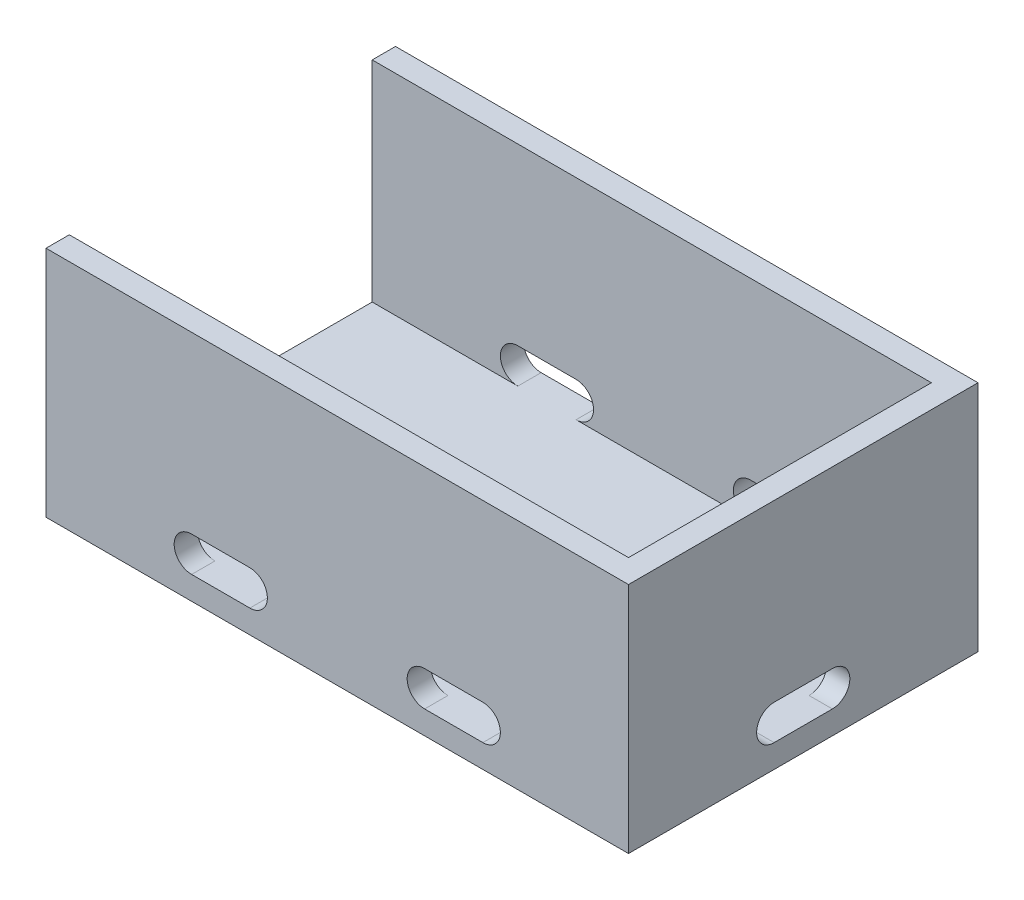
ISO-10303-21;
HEADER;
FILE_DESCRIPTION(('STEP AP214'),'2;1');
FILE_NAME('part.step','',(''),(''),'','','');
FILE_SCHEMA(('AUTOMOTIVE_DESIGN { 1 0 10303 214 1 1 1 1 }'));
ENDSEC;
DATA;
#1=APPLICATION_CONTEXT('core data for automotive mechanical design processes');
#2=APPLICATION_PROTOCOL_DEFINITION('international standard','automotive_design',2000,#1);
#3=PRODUCT_CONTEXT('',#1,'mechanical');
#4=PRODUCT('Part','Part','',(#3));
#5=PRODUCT_RELATED_PRODUCT_CATEGORY('part','',(#4));
#6=PRODUCT_DEFINITION_FORMATION('','',#4);
#7=PRODUCT_DEFINITION_CONTEXT('part definition',#1,'design');
#8=PRODUCT_DEFINITION('design','',#6,#7);
#9=PRODUCT_DEFINITION_SHAPE('','',#8);
#10=(LENGTH_UNIT() NAMED_UNIT(*) SI_UNIT(.MILLI.,.METRE.));
#11=(NAMED_UNIT(*) PLANE_ANGLE_UNIT() SI_UNIT($,.RADIAN.));
#12=(NAMED_UNIT(*) SI_UNIT($,.STERADIAN.) SOLID_ANGLE_UNIT());
#13=UNCERTAINTY_MEASURE_WITH_UNIT(LENGTH_MEASURE(1.E-05),#10,'distance_accuracy_value','');
#14=(GEOMETRIC_REPRESENTATION_CONTEXT(3) GLOBAL_UNCERTAINTY_ASSIGNED_CONTEXT((#13)) GLOBAL_UNIT_ASSIGNED_CONTEXT((#10,
#11,#12)) REPRESENTATION_CONTEXT('',''));
#15=CARTESIAN_POINT('',(0.,0.,0.));
#16=DIRECTION('',(0.,0.,1.));
#17=DIRECTION('',(1.,0.,0.));
#18=AXIS2_PLACEMENT_3D('',#15,#16,#17);
#19=CARTESIAN_POINT('',(0.,18.,-2.));
#20=DIRECTION('',(0.,0.,1.));
#21=DIRECTION('',(1.,0.,0.));
#22=AXIS2_PLACEMENT_3D('',#19,#20,#21);
#23=PLANE('',#22);
#24=DIRECTION('',(1.,0.,0.));
#25=VECTOR('',#24,1.);
#26=CARTESIAN_POINT('',(0.,3.,-2.));
#27=LINE('',#26,#25);
#28=CARTESIAN_POINT('',(12.5,2.99999999999999,-2.));
#29=VERTEX_POINT('',#28);
#30=CARTESIAN_POINT('',(17.5,2.99999999999999,-2.));
#31=VERTEX_POINT('',#30);
#32=EDGE_CURVE('E379',#29,#31,#27,.T.);
#33=ORIENTED_EDGE('',*,*,#32,.F.);
#34=CARTESIAN_POINT('',(12.5,1.49999999999999,-2.));
#35=DIRECTION('',(0.,0.,1.));
#36=DIRECTION('',(1.,0.,0.));
#37=AXIS2_PLACEMENT_3D('',#34,#35,#36);
#38=CIRCLE('',#37,1.5);
#39=CARTESIAN_POINT('',(12.5,0.,-2.));
#40=VERTEX_POINT('',#39);
#41=EDGE_CURVE('E369',#29,#40,#38,.T.);
#42=ORIENTED_EDGE('',*,*,#41,.T.);
#43=DIRECTION('',(-1.,0.,0.));
#44=VECTOR('',#43,1.);
#45=CARTESIAN_POINT('',(0.,0.,-2.));
#46=LINE('',#45,#44);
#47=CARTESIAN_POINT('',(0.,0.,-2.));
#48=VERTEX_POINT('',#47);
#49=EDGE_CURVE('E400',#40,#48,#46,.T.);
#50=ORIENTED_EDGE('',*,*,#49,.T.);
#51=DIRECTION('',(0.,-1.,0.));
#52=VECTOR('',#51,1.);
#53=CARTESIAN_POINT('',(0.,18.,-2.));
#54=LINE('',#53,#52);
#55=CARTESIAN_POINT('',(0.,18.,-2.));
#56=VERTEX_POINT('',#55);
#57=EDGE_CURVE('E471',#56,#48,#54,.T.);
#58=ORIENTED_EDGE('',*,*,#57,.F.);
#59=DIRECTION('',(-1.,0.,0.));
#60=VECTOR('',#59,1.);
#61=CARTESIAN_POINT('',(0.,18.,-2.));
#62=LINE('',#61,#60);
#63=CARTESIAN_POINT('',(48.,18.,-2.));
#64=VERTEX_POINT('',#63);
#65=EDGE_CURVE('E403',#64,#56,#62,.T.);
#66=ORIENTED_EDGE('',*,*,#65,.F.);
#67=DIRECTION('',(0.,-1.,0.));
#68=VECTOR('',#67,1.);
#69=CARTESIAN_POINT('',(48.,18.,-2.));
#70=LINE('',#69,#68);
#71=CARTESIAN_POINT('',(48.,0.,-2.));
#72=VERTEX_POINT('',#71);
#73=EDGE_CURVE('E433',#64,#72,#70,.T.);
#74=ORIENTED_EDGE('',*,*,#73,.T.);
#75=CARTESIAN_POINT('',(37.5,0.,-2.));
#76=VERTEX_POINT('',#75);
#77=EDGE_CURVE('E434',#72,#76,#46,.T.);
#78=ORIENTED_EDGE('',*,*,#77,.T.);
#79=CARTESIAN_POINT('',(37.5,1.49999999999999,-2.));
#80=DIRECTION('',(0.,0.,1.));
#81=DIRECTION('',(1.,0.,0.));
#82=AXIS2_PLACEMENT_3D('',#79,#80,#81);
#83=CIRCLE('',#82,1.5);
#84=CARTESIAN_POINT('',(37.5,2.99999999999999,-2.));
#85=VERTEX_POINT('',#84);
#86=EDGE_CURVE('E352',#85,#76,#83,.F.);
#87=ORIENTED_EDGE('',*,*,#86,.F.);
#88=DIRECTION('',(-1.,0.,0.));
#89=VECTOR('',#88,1.);
#90=CARTESIAN_POINT('',(0.,2.99999999999999,-2.));
#91=LINE('',#90,#89);
#92=CARTESIAN_POINT('',(32.5,2.99999999999999,-2.));
#93=VERTEX_POINT('',#92);
#94=EDGE_CURVE('E374',#85,#93,#91,.T.);
#95=ORIENTED_EDGE('',*,*,#94,.T.);
#96=CARTESIAN_POINT('',(32.5,1.5,-2.));
#97=DIRECTION('',(0.,0.,1.));
#98=DIRECTION('',(1.,0.,0.));
#99=AXIS2_PLACEMENT_3D('',#96,#97,#98);
#100=CIRCLE('',#99,1.5);
#101=CARTESIAN_POINT('',(32.5,0.,-2.));
#102=VERTEX_POINT('',#101);
#103=EDGE_CURVE('E343',#102,#93,#100,.F.);
#104=ORIENTED_EDGE('',*,*,#103,.F.);
#105=CARTESIAN_POINT('',(17.5,0.,-2.));
#106=VERTEX_POINT('',#105);
#107=EDGE_CURVE('E439',#102,#106,#46,.T.);
#108=ORIENTED_EDGE('',*,*,#107,.T.);
#109=CARTESIAN_POINT('',(17.5,1.5,-2.));
#110=DIRECTION('',(0.,0.,1.));
#111=DIRECTION('',(1.,0.,0.));
#112=AXIS2_PLACEMENT_3D('',#109,#110,#111);
#113=CIRCLE('',#112,1.5);
#114=EDGE_CURVE('E360',#106,#31,#113,.T.);
#115=ORIENTED_EDGE('',*,*,#114,.T.);
#116=EDGE_LOOP('',(#33,#42,#50,#58,#66,#74,#78,#87,#95,#104,#108,#115));
#117=FACE_BOUND('',#116,.T.);
#118=ADVANCED_FACE('F45',(#117),#23,.F.);
#119=CARTESIAN_POINT('',(0.,18.,0.));
#120=DIRECTION('',(0.,0.,1.));
#121=DIRECTION('',(1.,0.,0.));
#122=AXIS2_PLACEMENT_3D('',#119,#120,#121);
#123=PLANE('',#122);
#124=CARTESIAN_POINT('',(12.5,1.49999999999999,0.));
#125=DIRECTION('',(0.,0.,1.));
#126=DIRECTION('',(1.,0.,0.));
#127=AXIS2_PLACEMENT_3D('',#124,#125,#126);
#128=CIRCLE('',#127,1.5);
#129=CARTESIAN_POINT('',(12.5,2.99999999999999,0.));
#130=VERTEX_POINT('',#129);
#131=CARTESIAN_POINT('',(12.5,0.,0.));
#132=VERTEX_POINT('',#131);
#133=EDGE_CURVE('E368',#130,#132,#128,.T.);
#134=ORIENTED_EDGE('',*,*,#133,.F.);
#135=DIRECTION('',(1.,0.,0.));
#136=VECTOR('',#135,1.);
#137=CARTESIAN_POINT('',(0.,3.,0.));
#138=LINE('',#137,#136);
#139=CARTESIAN_POINT('',(17.5,2.99999999999999,0.));
#140=VERTEX_POINT('',#139);
#141=EDGE_CURVE('E383',#130,#140,#138,.T.);
#142=ORIENTED_EDGE('',*,*,#141,.T.);
#143=CARTESIAN_POINT('',(17.5,1.5,0.));
#144=DIRECTION('',(0.,0.,1.));
#145=DIRECTION('',(1.,0.,0.));
#146=AXIS2_PLACEMENT_3D('',#143,#144,#145);
#147=CIRCLE('',#146,1.5);
#148=CARTESIAN_POINT('',(17.5,0.,0.));
#149=VERTEX_POINT('',#148);
#150=EDGE_CURVE('E359',#149,#140,#147,.T.);
#151=ORIENTED_EDGE('',*,*,#150,.F.);
#152=DIRECTION('',(1.,0.,0.));
#153=VECTOR('',#152,1.);
#154=CARTESIAN_POINT('',(12.5,0.,0.));
#155=LINE('',#154,#153);
#156=EDGE_CURVE('E489',#132,#149,#155,.T.);
#157=ORIENTED_EDGE('',*,*,#156,.F.);
#158=EDGE_LOOP('',(#134,#142,#151,#157));
#159=FACE_BOUND('',#158,.T.);
#160=DIRECTION('',(0.,-1.,0.));
#161=VECTOR('',#160,1.);
#162=CARTESIAN_POINT('',(0.,18.,0.));
#163=LINE('',#162,#161);
#164=CARTESIAN_POINT('',(0.,18.,0.));
#165=VERTEX_POINT('',#164);
#166=CARTESIAN_POINT('',(0.,-2.,0.));
#167=VERTEX_POINT('',#166);
#168=EDGE_CURVE('E468',#165,#167,#163,.T.);
#169=ORIENTED_EDGE('',*,*,#168,.T.);
#170=DIRECTION('',(-1.,0.,0.));
#171=VECTOR('',#170,1.);
#172=CARTESIAN_POINT('',(0.,-2.,0.));
#173=LINE('',#172,#171);
#174=CARTESIAN_POINT('',(50.,-2.,0.));
#175=VERTEX_POINT('',#174);
#176=EDGE_CURVE('E396',#175,#167,#173,.T.);
#177=ORIENTED_EDGE('',*,*,#176,.F.);
#178=DIRECTION('',(0.,-1.,0.));
#179=VECTOR('',#178,1.);
#180=CARTESIAN_POINT('',(50.,18.,0.));
#181=LINE('',#180,#179);
#182=CARTESIAN_POINT('',(50.,18.,0.));
#183=VERTEX_POINT('',#182);
#184=EDGE_CURVE('E465',#183,#175,#181,.T.);
#185=ORIENTED_EDGE('',*,*,#184,.F.);
#186=DIRECTION('',(1.,0.,0.));
#187=VECTOR('',#186,1.);
#188=CARTESIAN_POINT('',(0.,18.,0.));
#189=LINE('',#188,#187);
#190=EDGE_CURVE('E411',#183,#165,#189,.F.);
#191=ORIENTED_EDGE('',*,*,#190,.T.);
#192=EDGE_LOOP('',(#169,#177,#185,#191));
#193=FACE_BOUND('',#192,.T.);
#194=DIRECTION('',(-1.,0.,0.));
#195=VECTOR('',#194,1.);
#196=CARTESIAN_POINT('',(37.5,2.99999999999999,0.));
#197=LINE('',#196,#195);
#198=CARTESIAN_POINT('',(37.5,2.99999999999999,0.));
#199=VERTEX_POINT('',#198);
#200=CARTESIAN_POINT('',(32.5,2.99999999999999,0.));
#201=VERTEX_POINT('',#200);
#202=EDGE_CURVE('E373',#199,#201,#197,.T.);
#203=ORIENTED_EDGE('',*,*,#202,.F.);
#204=CARTESIAN_POINT('',(37.5,1.49999999999999,0.));
#205=DIRECTION('',(0.,0.,1.));
#206=DIRECTION('',(1.,0.,0.));
#207=AXIS2_PLACEMENT_3D('',#204,#205,#206);
#208=CIRCLE('',#207,1.5);
#209=CARTESIAN_POINT('',(37.5,0.,0.));
#210=VERTEX_POINT('',#209);
#211=EDGE_CURVE('E351',#199,#210,#208,.F.);
#212=ORIENTED_EDGE('',*,*,#211,.T.);
#213=DIRECTION('',(1.,0.,0.));
#214=VECTOR('',#213,1.);
#215=CARTESIAN_POINT('',(0.,0.,0.));
#216=LINE('',#215,#214);
#217=CARTESIAN_POINT('',(32.5,0.,0.));
#218=VERTEX_POINT('',#217);
#219=EDGE_CURVE('E378',#210,#218,#216,.F.);
#220=ORIENTED_EDGE('',*,*,#219,.T.);
#221=CARTESIAN_POINT('',(32.5,1.5,0.));
#222=DIRECTION('',(0.,0.,1.));
#223=DIRECTION('',(1.,0.,0.));
#224=AXIS2_PLACEMENT_3D('',#221,#222,#223);
#225=CIRCLE('',#224,1.5);
#226=EDGE_CURVE('E342',#218,#201,#225,.F.);
#227=ORIENTED_EDGE('',*,*,#226,.T.);
#228=EDGE_LOOP('',(#203,#212,#220,#227));
#229=FACE_BOUND('',#228,.T.);
#230=ADVANCED_FACE('F509',(#159,#193,#229),#123,.T.);
#231=CARTESIAN_POINT('',(0.,18.,-30.));
#232=DIRECTION('',(0.,0.,-1.));
#233=DIRECTION('',(-1.,0.,0.));
#234=AXIS2_PLACEMENT_3D('',#231,#232,#233);
#235=PLANE('',#234);
#236=CARTESIAN_POINT('',(12.5,1.49999999999999,-30.));
#237=DIRECTION('',(0.,0.,1.));
#238=DIRECTION('',(1.,0.,0.));
#239=AXIS2_PLACEMENT_3D('',#236,#237,#238);
#240=CIRCLE('',#239,1.5);
#241=CARTESIAN_POINT('',(12.5,2.99999999999999,-30.));
#242=VERTEX_POINT('',#241);
#243=CARTESIAN_POINT('',(12.5,0.,-30.));
#244=VERTEX_POINT('',#243);
#245=EDGE_CURVE('E275',#242,#244,#240,.T.);
#246=ORIENTED_EDGE('',*,*,#245,.T.);
#247=DIRECTION('',(1.,0.,0.));
#248=VECTOR('',#247,1.);
#249=CARTESIAN_POINT('',(12.5,0.,-30.));
#250=LINE('',#249,#248);
#251=CARTESIAN_POINT('',(17.5,0.,-30.));
#252=VERTEX_POINT('',#251);
#253=EDGE_CURVE('E279',#244,#252,#250,.T.);
#254=ORIENTED_EDGE('',*,*,#253,.T.);
#255=CARTESIAN_POINT('',(17.5,1.5,-30.));
#256=DIRECTION('',(0.,0.,1.));
#257=DIRECTION('',(1.,0.,0.));
#258=AXIS2_PLACEMENT_3D('',#255,#256,#257);
#259=CIRCLE('',#258,1.5);
#260=CARTESIAN_POINT('',(17.5,2.99999999999999,-30.));
#261=VERTEX_POINT('',#260);
#262=EDGE_CURVE('E284',#252,#261,#259,.T.);
#263=ORIENTED_EDGE('',*,*,#262,.T.);
#264=DIRECTION('',(1.,0.,0.));
#265=VECTOR('',#264,1.);
#266=CARTESIAN_POINT('',(12.5,2.99999999999999,-30.));
#267=LINE('',#266,#265);
#268=EDGE_CURVE('E288',#242,#261,#267,.T.);
#269=ORIENTED_EDGE('',*,*,#268,.F.);
#270=EDGE_LOOP('',(#246,#254,#263,#269));
#271=FACE_BOUND('',#270,.T.);
#272=DIRECTION('',(0.,-1.,0.));
#273=VECTOR('',#272,1.);
#274=CARTESIAN_POINT('',(50.,18.,-30.));
#275=LINE('',#274,#273);
#276=CARTESIAN_POINT('',(50.,18.,-30.));
#277=VERTEX_POINT('',#276);
#278=CARTESIAN_POINT('',(50.,-2.,-30.));
#279=VERTEX_POINT('',#278);
#280=EDGE_CURVE('E462',#277,#279,#275,.T.);
#281=ORIENTED_EDGE('',*,*,#280,.T.);
#282=DIRECTION('',(1.,0.,0.));
#283=VECTOR('',#282,1.);
#284=CARTESIAN_POINT('',(0.,-2.,-30.));
#285=LINE('',#284,#283);
#286=CARTESIAN_POINT('',(0.,-2.,-30.));
#287=VERTEX_POINT('',#286);
#288=EDGE_CURVE('E388',#287,#279,#285,.T.);
#289=ORIENTED_EDGE('',*,*,#288,.F.);
#290=DIRECTION('',(0.,-1.,0.));
#291=VECTOR('',#290,1.);
#292=CARTESIAN_POINT('',(0.,18.,-30.));
#293=LINE('',#292,#291);
#294=CARTESIAN_POINT('',(0.,18.,-30.));
#295=VERTEX_POINT('',#294);
#296=EDGE_CURVE('E459',#295,#287,#293,.T.);
#297=ORIENTED_EDGE('',*,*,#296,.F.);
#298=DIRECTION('',(1.,0.,0.));
#299=VECTOR('',#298,1.);
#300=CARTESIAN_POINT('',(0.,18.,-30.));
#301=LINE('',#300,#299);
#302=EDGE_CURVE('E419',#295,#277,#301,.T.);
#303=ORIENTED_EDGE('',*,*,#302,.T.);
#304=EDGE_LOOP('',(#281,#289,#297,#303));
#305=FACE_BOUND('',#304,.T.);
#306=DIRECTION('',(-1.,0.,0.));
#307=VECTOR('',#306,1.);
#308=CARTESIAN_POINT('',(37.5,0.,-30.));
#309=LINE('',#308,#307);
#310=CARTESIAN_POINT('',(37.5,0.,-30.));
#311=VERTEX_POINT('',#310);
#312=CARTESIAN_POINT('',(32.5,0.,-30.));
#313=VERTEX_POINT('',#312);
#314=EDGE_CURVE('E335',#311,#313,#309,.T.);
#315=ORIENTED_EDGE('',*,*,#314,.F.);
#316=CARTESIAN_POINT('',(37.5,1.49999999999999,-30.));
#317=DIRECTION('',(0.,0.,-1.));
#318=DIRECTION('',(-1.,0.,0.));
#319=AXIS2_PLACEMENT_3D('',#316,#317,#318);
#320=CIRCLE('',#319,1.5);
#321=CARTESIAN_POINT('',(37.5,2.99999999999999,-30.));
#322=VERTEX_POINT('',#321);
#323=EDGE_CURVE('E280',#322,#311,#320,.T.);
#324=ORIENTED_EDGE('',*,*,#323,.F.);
#325=DIRECTION('',(-1.,0.,0.));
#326=VECTOR('',#325,1.);
#327=CARTESIAN_POINT('',(37.5,2.99999999999999,-30.));
#328=LINE('',#327,#326);
#329=CARTESIAN_POINT('',(32.5,2.99999999999999,-30.));
#330=VERTEX_POINT('',#329);
#331=EDGE_CURVE('E313',#322,#330,#328,.T.);
#332=ORIENTED_EDGE('',*,*,#331,.T.);
#333=CARTESIAN_POINT('',(32.5,1.5,-30.));
#334=DIRECTION('',(0.,0.,-1.));
#335=DIRECTION('',(-1.,0.,0.));
#336=AXIS2_PLACEMENT_3D('',#333,#334,#335);
#337=CIRCLE('',#336,1.5);
#338=EDGE_CURVE('E331',#313,#330,#337,.T.);
#339=ORIENTED_EDGE('',*,*,#338,.F.);
#340=EDGE_LOOP('',(#315,#324,#332,#339));
#341=FACE_BOUND('',#340,.T.);
#342=ADVANCED_FACE('F572',(#271,#305,#341),#235,.T.);
#343=CARTESIAN_POINT('',(0.,18.,-28.));
#344=DIRECTION('',(0.,0.,-1.));
#345=DIRECTION('',(-1.,0.,0.));
#346=AXIS2_PLACEMENT_3D('',#343,#344,#345);
#347=PLANE('',#346);
#348=DIRECTION('',(1.,0.,0.));
#349=VECTOR('',#348,1.);
#350=CARTESIAN_POINT('',(0.,0.,-28.));
#351=LINE('',#350,#349);
#352=CARTESIAN_POINT('',(0.,0.,-28.));
#353=VERTEX_POINT('',#352);
#354=CARTESIAN_POINT('',(12.5,0.,-28.));
#355=VERTEX_POINT('',#354);
#356=EDGE_CURVE('E440',#353,#355,#351,.T.);
#357=ORIENTED_EDGE('',*,*,#356,.T.);
#358=CARTESIAN_POINT('',(12.5,1.49999999999999,-28.));
#359=DIRECTION('',(0.,0.,-1.));
#360=DIRECTION('',(-1.,0.,0.));
#361=AXIS2_PLACEMENT_3D('',#358,#359,#360);
#362=CIRCLE('',#361,1.5);
#363=CARTESIAN_POINT('',(12.5,2.99999999999999,-28.));
#364=VERTEX_POINT('',#363);
#365=EDGE_CURVE('E364',#355,#364,#362,.T.);
#366=ORIENTED_EDGE('',*,*,#365,.T.);
#367=DIRECTION('',(-1.,0.,0.));
#368=VECTOR('',#367,1.);
#369=CARTESIAN_POINT('',(0.,3.,-28.));
#370=LINE('',#369,#368);
#371=CARTESIAN_POINT('',(17.5,2.99999999999999,-28.));
#372=VERTEX_POINT('',#371);
#373=EDGE_CURVE('E53',#372,#364,#370,.T.);
#374=ORIENTED_EDGE('',*,*,#373,.F.);
#375=CARTESIAN_POINT('',(17.5,1.5,-28.));
#376=DIRECTION('',(0.,0.,-1.));
#377=DIRECTION('',(-1.,0.,0.));
#378=AXIS2_PLACEMENT_3D('',#375,#376,#377);
#379=CIRCLE('',#378,1.5);
#380=CARTESIAN_POINT('',(17.5,0.,-28.));
#381=VERTEX_POINT('',#380);
#382=EDGE_CURVE('E355',#372,#381,#379,.T.);
#383=ORIENTED_EDGE('',*,*,#382,.T.);
#384=CARTESIAN_POINT('',(32.5,0.,-28.));
#385=VERTEX_POINT('',#384);
#386=EDGE_CURVE('E445',#381,#385,#351,.T.);
#387=ORIENTED_EDGE('',*,*,#386,.T.);
#388=CARTESIAN_POINT('',(32.5,1.5,-28.));
#389=DIRECTION('',(0.,0.,-1.));
#390=DIRECTION('',(-1.,0.,0.));
#391=AXIS2_PLACEMENT_3D('',#388,#389,#390);
#392=CIRCLE('',#391,1.5);
#393=CARTESIAN_POINT('',(32.5,2.99999999999999,-28.));
#394=VERTEX_POINT('',#393);
#395=EDGE_CURVE('E296',#394,#385,#392,.F.);
#396=ORIENTED_EDGE('',*,*,#395,.F.);
#397=DIRECTION('',(1.,0.,0.));
#398=VECTOR('',#397,1.);
#399=CARTESIAN_POINT('',(0.,2.99999999999999,-28.));
#400=LINE('',#399,#398);
#401=CARTESIAN_POINT('',(37.5,2.99999999999999,-28.));
#402=VERTEX_POINT('',#401);
#403=EDGE_CURVE('E475',#394,#402,#400,.T.);
#404=ORIENTED_EDGE('',*,*,#403,.T.);
#405=CARTESIAN_POINT('',(37.5,1.49999999999999,-28.));
#406=DIRECTION('',(0.,0.,-1.));
#407=DIRECTION('',(-1.,0.,0.));
#408=AXIS2_PLACEMENT_3D('',#405,#406,#407);
#409=CIRCLE('',#408,1.5);
#410=CARTESIAN_POINT('',(37.5,0.,-28.));
#411=VERTEX_POINT('',#410);
#412=EDGE_CURVE('E347',#411,#402,#409,.F.);
#413=ORIENTED_EDGE('',*,*,#412,.F.);
#414=CARTESIAN_POINT('',(48.,0.,-28.));
#415=VERTEX_POINT('',#414);
#416=EDGE_CURVE('E438',#411,#415,#351,.T.);
#417=ORIENTED_EDGE('',*,*,#416,.T.);
#418=DIRECTION('',(0.,-1.,0.));
#419=VECTOR('',#418,1.);
#420=CARTESIAN_POINT('',(48.,18.,-28.));
#421=LINE('',#420,#419);
#422=CARTESIAN_POINT('',(48.,18.,-28.));
#423=VERTEX_POINT('',#422);
#424=EDGE_CURVE('E451',#423,#415,#421,.T.);
#425=ORIENTED_EDGE('',*,*,#424,.F.);
#426=DIRECTION('',(1.,0.,0.));
#427=VECTOR('',#426,1.);
#428=CARTESIAN_POINT('',(0.,18.,-28.));
#429=LINE('',#428,#427);
#430=CARTESIAN_POINT('',(0.,18.,-28.));
#431=VERTEX_POINT('',#430);
#432=EDGE_CURVE('E427',#431,#423,#429,.T.);
#433=ORIENTED_EDGE('',*,*,#432,.F.);
#434=DIRECTION('',(0.,-1.,0.));
#435=VECTOR('',#434,1.);
#436=CARTESIAN_POINT('',(0.,18.,-28.));
#437=LINE('',#436,#435);
#438=EDGE_CURVE('E455',#431,#353,#437,.T.);
#439=ORIENTED_EDGE('',*,*,#438,.T.);
#440=EDGE_LOOP('',(#357,#366,#374,#383,#387,#396,#404,#413,#417,#425,#433,#439));
#441=FACE_BOUND('',#440,.T.);
#442=ADVANCED_FACE('F579',(#441),#347,.F.);
#443=CARTESIAN_POINT('',(50.,18.,-28.));
#444=DIRECTION('',(1.,0.,0.));
#445=DIRECTION('',(0.,0.,-1.));
#446=AXIS2_PLACEMENT_3D('',#443,#444,#445);
#447=PLANE('',#446);
#448=CARTESIAN_POINT('',(50.,1.5,-17.5));
#449=DIRECTION('',(-1.,0.,0.));
#450=DIRECTION('',(0.,0.,1.));
#451=AXIS2_PLACEMENT_3D('',#448,#449,#450);
#452=CIRCLE('',#451,1.5);
#453=CARTESIAN_POINT('',(50.,3.,-17.5));
#454=VERTEX_POINT('',#453);
#455=CARTESIAN_POINT('',(50.,0.,-17.5));
#456=VERTEX_POINT('',#455);
#457=EDGE_CURVE('E233',#454,#456,#452,.T.);
#458=ORIENTED_EDGE('',*,*,#457,.T.);
#459=DIRECTION('',(0.,0.,1.));
#460=VECTOR('',#459,1.);
#461=CARTESIAN_POINT('',(50.,0.,-17.5));
#462=LINE('',#461,#460);
#463=CARTESIAN_POINT('',(50.,0.,-12.5));
#464=VERTEX_POINT('',#463);
#465=EDGE_CURVE('E243',#456,#464,#462,.T.);
#466=ORIENTED_EDGE('',*,*,#465,.T.);
#467=CARTESIAN_POINT('',(50.,1.5,-12.5));
#468=DIRECTION('',(-1.,0.,0.));
#469=DIRECTION('',(0.,0.,1.));
#470=AXIS2_PLACEMENT_3D('',#467,#468,#469);
#471=CIRCLE('',#470,1.5);
#472=CARTESIAN_POINT('',(50.,3.,-12.5));
#473=VERTEX_POINT('',#472);
#474=EDGE_CURVE('E60',#464,#473,#471,.T.);
#475=ORIENTED_EDGE('',*,*,#474,.T.);
#476=DIRECTION('',(0.,0.,-1.));
#477=VECTOR('',#476,1.);
#478=CARTESIAN_POINT('',(50.,3.,-17.5));
#479=LINE('',#478,#477);
#480=EDGE_CURVE('E240',#473,#454,#479,.T.);
#481=ORIENTED_EDGE('',*,*,#480,.T.);
#482=EDGE_LOOP('',(#458,#466,#475,#481));
#483=FACE_BOUND('',#482,.T.);
#484=ORIENTED_EDGE('',*,*,#184,.T.);
#485=DIRECTION('',(0.,0.,1.));
#486=VECTOR('',#485,1.);
#487=CARTESIAN_POINT('',(50.,-2.,0.));
#488=LINE('',#487,#486);
#489=EDGE_CURVE('E392',#279,#175,#488,.T.);
#490=ORIENTED_EDGE('',*,*,#489,.F.);
#491=ORIENTED_EDGE('',*,*,#280,.F.);
#492=DIRECTION('',(0.,0.,-1.));
#493=VECTOR('',#492,1.);
#494=CARTESIAN_POINT('',(50.,18.,-28.));
#495=LINE('',#494,#493);
#496=EDGE_CURVE('E415',#277,#183,#495,.F.);
#497=ORIENTED_EDGE('',*,*,#496,.T.);
#498=EDGE_LOOP('',(#484,#490,#491,#497));
#499=FACE_BOUND('',#498,.T.);
#500=ADVANCED_FACE('F249',(#483,#499),#447,.T.);
#501=CARTESIAN_POINT('',(0.,18.,-28.));
#502=DIRECTION('',(-1.,0.,0.));
#503=DIRECTION('',(0.,0.,1.));
#504=AXIS2_PLACEMENT_3D('',#501,#502,#503);
#505=PLANE('',#504);
#506=ORIENTED_EDGE('',*,*,#296,.T.);
#507=DIRECTION('',(0.,0.,-1.));
#508=VECTOR('',#507,1.);
#509=CARTESIAN_POINT('',(0.,-2.,0.));
#510=LINE('',#509,#508);
#511=EDGE_CURVE('E384',#167,#287,#510,.T.);
#512=ORIENTED_EDGE('',*,*,#511,.F.);
#513=ORIENTED_EDGE('',*,*,#168,.F.);
#514=DIRECTION('',(0.,0.,-1.));
#515=VECTOR('',#514,1.);
#516=CARTESIAN_POINT('',(0.,18.,0.));
#517=LINE('',#516,#515);
#518=EDGE_CURVE('E406',#165,#56,#517,.T.);
#519=ORIENTED_EDGE('',*,*,#518,.T.);
#520=ORIENTED_EDGE('',*,*,#57,.T.);
#521=DIRECTION('',(0.,0.,-1.));
#522=VECTOR('',#521,1.);
#523=CARTESIAN_POINT('',(0.,0.,0.));
#524=LINE('',#523,#522);
#525=EDGE_CURVE('E382',#48,#353,#524,.T.);
#526=ORIENTED_EDGE('',*,*,#525,.T.);
#527=ORIENTED_EDGE('',*,*,#438,.F.);
#528=DIRECTION('',(0.,0.,-1.));
#529=VECTOR('',#528,1.);
#530=CARTESIAN_POINT('',(0.,18.,-28.));
#531=LINE('',#530,#529);
#532=EDGE_CURVE('E423',#431,#295,#531,.T.);
#533=ORIENTED_EDGE('',*,*,#532,.T.);
#534=EDGE_LOOP('',(#506,#512,#513,#519,#520,#526,#527,#533));
#535=FACE_BOUND('',#534,.T.);
#536=ADVANCED_FACE('F559',(#535),#505,.T.);
#537=CARTESIAN_POINT('',(48.,18.,-28.));
#538=DIRECTION('',(1.,0.,0.));
#539=DIRECTION('',(0.,0.,-1.));
#540=AXIS2_PLACEMENT_3D('',#537,#538,#539);
#541=PLANE('',#540);
#542=DIRECTION('',(0.,0.,1.));
#543=VECTOR('',#542,1.);
#544=CARTESIAN_POINT('',(48.,0.,-28.));
#545=LINE('',#544,#543);
#546=CARTESIAN_POINT('',(48.,0.,-17.5));
#547=VERTEX_POINT('',#546);
#548=EDGE_CURVE('E407',#415,#547,#545,.T.);
#549=ORIENTED_EDGE('',*,*,#548,.T.);
#550=CARTESIAN_POINT('',(48.,1.5,-17.5));
#551=DIRECTION('',(1.,0.,0.));
#552=DIRECTION('',(0.,0.,-1.));
#553=AXIS2_PLACEMENT_3D('',#550,#551,#552);
#554=CIRCLE('',#553,1.5);
#555=CARTESIAN_POINT('',(48.,3.,-17.5));
#556=VERTEX_POINT('',#555);
#557=EDGE_CURVE('E236',#547,#556,#554,.T.);
#558=ORIENTED_EDGE('',*,*,#557,.T.);
#559=DIRECTION('',(0.,0.,1.));
#560=VECTOR('',#559,1.);
#561=CARTESIAN_POINT('',(48.,3.,-28.));
#562=LINE('',#561,#560);
#563=CARTESIAN_POINT('',(48.,3.,-12.5));
#564=VERTEX_POINT('',#563);
#565=EDGE_CURVE('E11',#556,#564,#562,.T.);
#566=ORIENTED_EDGE('',*,*,#565,.T.);
#567=CARTESIAN_POINT('',(48.,1.5,-12.5));
#568=DIRECTION('',(1.,0.,0.));
#569=DIRECTION('',(0.,0.,-1.));
#570=AXIS2_PLACEMENT_3D('',#567,#568,#569);
#571=CIRCLE('',#570,1.5);
#572=CARTESIAN_POINT('',(48.,0.,-12.5));
#573=VERTEX_POINT('',#572);
#574=EDGE_CURVE('E262',#564,#573,#571,.T.);
#575=ORIENTED_EDGE('',*,*,#574,.T.);
#576=EDGE_CURVE('E444',#573,#72,#545,.T.);
#577=ORIENTED_EDGE('',*,*,#576,.T.);
#578=ORIENTED_EDGE('',*,*,#73,.F.);
#579=DIRECTION('',(0.,0.,1.));
#580=VECTOR('',#579,1.);
#581=CARTESIAN_POINT('',(48.,18.,-28.));
#582=LINE('',#581,#580);
#583=EDGE_CURVE('E430',#423,#64,#582,.T.);
#584=ORIENTED_EDGE('',*,*,#583,.F.);
#585=ORIENTED_EDGE('',*,*,#424,.T.);
#586=EDGE_LOOP('',(#549,#558,#566,#575,#577,#578,#584,#585));
#587=FACE_BOUND('',#586,.T.);
#588=ADVANCED_FACE('F581',(#587),#541,.F.);
#589=CARTESIAN_POINT('',(0.,18.,0.));
#590=DIRECTION('',(0.,-1.,0.));
#591=DIRECTION('',(-1.,0.,0.));
#592=AXIS2_PLACEMENT_3D('',#589,#590,#591);
#593=PLANE('',#592);
#594=ORIENTED_EDGE('',*,*,#65,.T.);
#595=ORIENTED_EDGE('',*,*,#518,.F.);
#596=ORIENTED_EDGE('',*,*,#190,.F.);
#597=ORIENTED_EDGE('',*,*,#496,.F.);
#598=ORIENTED_EDGE('',*,*,#302,.F.);
#599=ORIENTED_EDGE('',*,*,#532,.F.);
#600=ORIENTED_EDGE('',*,*,#432,.T.);
#601=ORIENTED_EDGE('',*,*,#583,.T.);
#602=EDGE_LOOP('',(#594,#595,#596,#597,#598,#599,#600,#601));
#603=FACE_BOUND('',#602,.T.);
#604=ADVANCED_FACE('F564',(#603),#593,.F.);
#605=CARTESIAN_POINT('',(0.,-2.,0.));
#606=DIRECTION('',(0.,-1.,0.));
#607=DIRECTION('',(0.,0.,-1.));
#608=AXIS2_PLACEMENT_3D('',#605,#606,#607);
#609=PLANE('',#608);
#610=ORIENTED_EDGE('',*,*,#511,.T.);
#611=ORIENTED_EDGE('',*,*,#288,.T.);
#612=ORIENTED_EDGE('',*,*,#489,.T.);
#613=ORIENTED_EDGE('',*,*,#176,.T.);
#614=EDGE_LOOP('',(#610,#611,#612,#613));
#615=FACE_BOUND('',#614,.T.);
#616=ADVANCED_FACE('F569',(#615),#609,.T.);
#617=CARTESIAN_POINT('',(0.,0.,0.));
#618=DIRECTION('',(0.,-1.,0.));
#619=DIRECTION('',(0.,0.,-1.));
#620=AXIS2_PLACEMENT_3D('',#617,#618,#619);
#621=PLANE('',#620);
#622=ORIENTED_EDGE('',*,*,#576,.F.);
#623=DIRECTION('',(-1.,0.,0.));
#624=VECTOR('',#623,1.);
#625=CARTESIAN_POINT('',(50.,0.,-12.5));
#626=LINE('',#625,#624);
#627=EDGE_CURVE('E239',#464,#573,#626,.T.);
#628=ORIENTED_EDGE('',*,*,#627,.F.);
#629=ORIENTED_EDGE('',*,*,#465,.F.);
#630=DIRECTION('',(-1.,0.,0.));
#631=VECTOR('',#630,1.);
#632=CARTESIAN_POINT('',(50.,0.,-17.5));
#633=LINE('',#632,#631);
#634=EDGE_CURVE('E68',#456,#547,#633,.T.);
#635=ORIENTED_EDGE('',*,*,#634,.T.);
#636=ORIENTED_EDGE('',*,*,#548,.F.);
#637=ORIENTED_EDGE('',*,*,#416,.F.);
#638=DIRECTION('',(0.,0.,1.));
#639=VECTOR('',#638,1.);
#640=CARTESIAN_POINT('',(37.5,0.,-30.));
#641=LINE('',#640,#639);
#642=EDGE_CURVE('E325',#311,#411,#641,.T.);
#643=ORIENTED_EDGE('',*,*,#642,.F.);
#644=ORIENTED_EDGE('',*,*,#314,.T.);
#645=DIRECTION('',(0.,0.,1.));
#646=VECTOR('',#645,1.);
#647=CARTESIAN_POINT('',(32.5,0.,-30.));
#648=LINE('',#647,#646);
#649=EDGE_CURVE('E320',#313,#385,#648,.T.);
#650=ORIENTED_EDGE('',*,*,#649,.T.);
#651=ORIENTED_EDGE('',*,*,#386,.F.);
#652=DIRECTION('',(0.,0.,1.));
#653=VECTOR('',#652,1.);
#654=CARTESIAN_POINT('',(17.5,0.,-30.));
#655=LINE('',#654,#653);
#656=EDGE_CURVE('E303',#252,#381,#655,.T.);
#657=ORIENTED_EDGE('',*,*,#656,.F.);
#658=ORIENTED_EDGE('',*,*,#253,.F.);
#659=DIRECTION('',(0.,0.,1.));
#660=VECTOR('',#659,1.);
#661=CARTESIAN_POINT('',(12.5,0.,-30.));
#662=LINE('',#661,#660);
#663=EDGE_CURVE('E307',#244,#355,#662,.T.);
#664=ORIENTED_EDGE('',*,*,#663,.T.);
#665=ORIENTED_EDGE('',*,*,#356,.F.);
#666=ORIENTED_EDGE('',*,*,#525,.F.);
#667=ORIENTED_EDGE('',*,*,#49,.F.);
#668=EDGE_CURVE('E291',#40,#132,#662,.T.);
#669=ORIENTED_EDGE('',*,*,#668,.T.);
#670=ORIENTED_EDGE('',*,*,#156,.T.);
#671=EDGE_CURVE('E306',#106,#149,#655,.T.);
#672=ORIENTED_EDGE('',*,*,#671,.F.);
#673=ORIENTED_EDGE('',*,*,#107,.F.);
#674=EDGE_CURVE('E324',#102,#218,#648,.T.);
#675=ORIENTED_EDGE('',*,*,#674,.T.);
#676=ORIENTED_EDGE('',*,*,#219,.F.);
#677=EDGE_CURVE('E274',#76,#210,#641,.T.);
#678=ORIENTED_EDGE('',*,*,#677,.F.);
#679=ORIENTED_EDGE('',*,*,#77,.F.);
#680=EDGE_LOOP('',(#622,#628,#629,#635,#636,#637,#643,#644,#650,#651,#657,#658,#664,#665,#666,
#667,#669,#670,#672,#673,#675,#676,#678,#679));
#681=FACE_BOUND('',#680,.T.);
#682=ADVANCED_FACE('F245',(#681),#621,.F.);
#683=CARTESIAN_POINT('',(37.5,2.99999999999999,-30.));
#684=DIRECTION('',(0.,1.,0.));
#685=DIRECTION('',(-1.,0.,0.));
#686=AXIS2_PLACEMENT_3D('',#683,#684,#685);
#687=PLANE('',#686);
#688=DIRECTION('',(0.,0.,1.));
#689=VECTOR('',#688,1.);
#690=CARTESIAN_POINT('',(32.5,2.99999999999999,-30.));
#691=LINE('',#690,#689);
#692=EDGE_CURVE('E315',#330,#394,#691,.T.);
#693=ORIENTED_EDGE('',*,*,#692,.F.);
#694=ORIENTED_EDGE('',*,*,#331,.F.);
#695=DIRECTION('',(0.,0.,1.));
#696=VECTOR('',#695,1.);
#697=CARTESIAN_POINT('',(37.5,2.99999999999999,-30.));
#698=LINE('',#697,#696);
#699=EDGE_CURVE('E310',#322,#402,#698,.T.);
#700=ORIENTED_EDGE('',*,*,#699,.T.);
#701=ORIENTED_EDGE('',*,*,#403,.F.);
#702=EDGE_LOOP('',(#693,#694,#700,#701));
#703=FACE_BOUND('',#702,.T.);
#704=ADVANCED_FACE('F613',(#703),#687,.F.);
#705=CARTESIAN_POINT('',(32.5,1.5,-30.));
#706=DIRECTION('',(0.,0.,1.));
#707=DIRECTION('',(1.,0.,0.));
#708=AXIS2_PLACEMENT_3D('',#705,#706,#707);
#709=CYLINDRICAL_SURFACE('',#708,1.5);
#710=ORIENTED_EDGE('',*,*,#395,.T.);
#711=ORIENTED_EDGE('',*,*,#649,.F.);
#712=ORIENTED_EDGE('',*,*,#338,.T.);
#713=ORIENTED_EDGE('',*,*,#692,.T.);
#714=EDGE_LOOP('',(#710,#711,#712,#713));
#715=FACE_BOUND('',#714,.T.);
#716=ADVANCED_FACE('F617',(#715),#709,.F.);
#717=CARTESIAN_POINT('',(37.5,1.49999999999999,-30.));
#718=DIRECTION('',(0.,0.,1.));
#719=DIRECTION('',(1.,0.,0.));
#720=AXIS2_PLACEMENT_3D('',#717,#718,#719);
#721=CYLINDRICAL_SURFACE('',#720,1.5);
#722=ORIENTED_EDGE('',*,*,#412,.T.);
#723=ORIENTED_EDGE('',*,*,#699,.F.);
#724=ORIENTED_EDGE('',*,*,#323,.T.);
#725=ORIENTED_EDGE('',*,*,#642,.T.);
#726=EDGE_LOOP('',(#722,#723,#724,#725));
#727=FACE_BOUND('',#726,.T.);
#728=ADVANCED_FACE('F627',(#727),#721,.F.);
#729=CARTESIAN_POINT('',(17.5,1.5,-30.));
#730=DIRECTION('',(0.,0.,1.));
#731=DIRECTION('',(1.,0.,0.));
#732=AXIS2_PLACEMENT_3D('',#729,#730,#731);
#733=CYLINDRICAL_SURFACE('',#732,1.5);
#734=DIRECTION('',(0.,0.,1.));
#735=VECTOR('',#734,1.);
#736=CARTESIAN_POINT('',(17.5,2.99999999999999,-30.));
#737=LINE('',#736,#735);
#738=EDGE_CURVE('E298',#261,#372,#737,.T.);
#739=ORIENTED_EDGE('',*,*,#738,.F.);
#740=ORIENTED_EDGE('',*,*,#262,.F.);
#741=ORIENTED_EDGE('',*,*,#656,.T.);
#742=ORIENTED_EDGE('',*,*,#382,.F.);
#743=EDGE_LOOP('',(#739,#740,#741,#742));
#744=FACE_BOUND('',#743,.T.);
#745=ADVANCED_FACE('F636',(#744),#733,.F.);
#746=CARTESIAN_POINT('',(12.5,2.99999999999999,-30.));
#747=DIRECTION('',(0.,-1.,0.));
#748=DIRECTION('',(1.,0.,0.));
#749=AXIS2_PLACEMENT_3D('',#746,#747,#748);
#750=PLANE('',#749);
#751=ORIENTED_EDGE('',*,*,#373,.T.);
#752=DIRECTION('',(0.,0.,1.));
#753=VECTOR('',#752,1.);
#754=CARTESIAN_POINT('',(12.5,2.99999999999999,-30.));
#755=LINE('',#754,#753);
#756=EDGE_CURVE('E292',#242,#364,#755,.T.);
#757=ORIENTED_EDGE('',*,*,#756,.F.);
#758=ORIENTED_EDGE('',*,*,#268,.T.);
#759=ORIENTED_EDGE('',*,*,#738,.T.);
#760=EDGE_LOOP('',(#751,#757,#758,#759));
#761=FACE_BOUND('',#760,.T.);
#762=ADVANCED_FACE('F645',(#761),#750,.T.);
#763=CARTESIAN_POINT('',(12.5,1.49999999999999,-30.));
#764=DIRECTION('',(0.,0.,1.));
#765=DIRECTION('',(1.,0.,0.));
#766=AXIS2_PLACEMENT_3D('',#763,#764,#765);
#767=CYLINDRICAL_SURFACE('',#766,1.5);
#768=ORIENTED_EDGE('',*,*,#663,.F.);
#769=ORIENTED_EDGE('',*,*,#245,.F.);
#770=ORIENTED_EDGE('',*,*,#756,.T.);
#771=ORIENTED_EDGE('',*,*,#365,.F.);
#772=EDGE_LOOP('',(#768,#769,#770,#771));
#773=FACE_BOUND('',#772,.T.);
#774=ADVANCED_FACE('F654',(#773),#767,.F.);
#775=EDGE_CURVE('E314',#85,#199,#698,.T.);
#776=ORIENTED_EDGE('',*,*,#775,.T.);
#777=ORIENTED_EDGE('',*,*,#202,.T.);
#778=EDGE_CURVE('E319',#93,#201,#691,.T.);
#779=ORIENTED_EDGE('',*,*,#778,.F.);
#780=ORIENTED_EDGE('',*,*,#94,.F.);
#781=EDGE_LOOP('',(#776,#777,#779,#780));
#782=FACE_BOUND('',#781,.T.);
#783=ADVANCED_FACE('F540',(#782),#687,.F.);
#784=ORIENTED_EDGE('',*,*,#86,.T.);
#785=ORIENTED_EDGE('',*,*,#677,.T.);
#786=ORIENTED_EDGE('',*,*,#211,.F.);
#787=ORIENTED_EDGE('',*,*,#775,.F.);
#788=EDGE_LOOP('',(#784,#785,#786,#787));
#789=FACE_BOUND('',#788,.T.);
#790=ADVANCED_FACE('F533',(#789),#721,.F.);
#791=ORIENTED_EDGE('',*,*,#103,.T.);
#792=ORIENTED_EDGE('',*,*,#778,.T.);
#793=ORIENTED_EDGE('',*,*,#226,.F.);
#794=ORIENTED_EDGE('',*,*,#674,.F.);
#795=EDGE_LOOP('',(#791,#792,#793,#794));
#796=FACE_BOUND('',#795,.T.);
#797=ADVANCED_FACE('F542',(#796),#709,.F.);
#798=ORIENTED_EDGE('',*,*,#32,.T.);
#799=EDGE_CURVE('E302',#31,#140,#737,.T.);
#800=ORIENTED_EDGE('',*,*,#799,.T.);
#801=ORIENTED_EDGE('',*,*,#141,.F.);
#802=EDGE_CURVE('E297',#29,#130,#755,.T.);
#803=ORIENTED_EDGE('',*,*,#802,.F.);
#804=EDGE_LOOP('',(#798,#800,#801,#803));
#805=FACE_BOUND('',#804,.T.);
#806=ADVANCED_FACE('F657',(#805),#750,.T.);
#807=ORIENTED_EDGE('',*,*,#802,.T.);
#808=ORIENTED_EDGE('',*,*,#133,.T.);
#809=ORIENTED_EDGE('',*,*,#668,.F.);
#810=ORIENTED_EDGE('',*,*,#41,.F.);
#811=EDGE_LOOP('',(#807,#808,#809,#810));
#812=FACE_BOUND('',#811,.T.);
#813=ADVANCED_FACE('F505',(#812),#767,.F.);
#814=ORIENTED_EDGE('',*,*,#671,.T.);
#815=ORIENTED_EDGE('',*,*,#150,.T.);
#816=ORIENTED_EDGE('',*,*,#799,.F.);
#817=ORIENTED_EDGE('',*,*,#114,.F.);
#818=EDGE_LOOP('',(#814,#815,#816,#817));
#819=FACE_BOUND('',#818,.T.);
#820=ADVANCED_FACE('F516',(#819),#733,.F.);
#821=CARTESIAN_POINT('',(50.,3.,-17.5));
#822=DIRECTION('',(0.,1.,0.));
#823=DIRECTION('',(0.,0.,1.));
#824=AXIS2_PLACEMENT_3D('',#821,#822,#823);
#825=PLANE('',#824);
#826=DIRECTION('',(-1.,0.,0.));
#827=VECTOR('',#826,1.);
#828=CARTESIAN_POINT('',(50.,3.,-17.5));
#829=LINE('',#828,#827);
#830=EDGE_CURVE('E259',#454,#556,#829,.T.);
#831=ORIENTED_EDGE('',*,*,#830,.F.);
#832=ORIENTED_EDGE('',*,*,#480,.F.);
#833=DIRECTION('',(-1.,0.,0.));
#834=VECTOR('',#833,1.);
#835=CARTESIAN_POINT('',(50.,3.,-12.5));
#836=LINE('',#835,#834);
#837=EDGE_CURVE('E263',#473,#564,#836,.T.);
#838=ORIENTED_EDGE('',*,*,#837,.T.);
#839=ORIENTED_EDGE('',*,*,#565,.F.);
#840=EDGE_LOOP('',(#831,#832,#838,#839));
#841=FACE_BOUND('',#840,.T.);
#842=ADVANCED_FACE('F702',(#841),#825,.F.);
#843=CARTESIAN_POINT('',(50.,1.5,-17.5));
#844=DIRECTION('',(-1.,0.,0.));
#845=DIRECTION('',(0.,0.,1.));
#846=AXIS2_PLACEMENT_3D('',#843,#844,#845);
#847=CYLINDRICAL_SURFACE('',#846,1.5);
#848=ORIENTED_EDGE('',*,*,#634,.F.);
#849=ORIENTED_EDGE('',*,*,#457,.F.);
#850=ORIENTED_EDGE('',*,*,#830,.T.);
#851=ORIENTED_EDGE('',*,*,#557,.F.);
#852=EDGE_LOOP('',(#848,#849,#850,#851));
#853=FACE_BOUND('',#852,.T.);
#854=ADVANCED_FACE('F230',(#853),#847,.F.);
#855=CARTESIAN_POINT('',(50.,1.5,-12.5));
#856=DIRECTION('',(-1.,0.,0.));
#857=DIRECTION('',(0.,0.,1.));
#858=AXIS2_PLACEMENT_3D('',#855,#856,#857);
#859=CYLINDRICAL_SURFACE('',#858,1.5);
#860=ORIENTED_EDGE('',*,*,#837,.F.);
#861=ORIENTED_EDGE('',*,*,#474,.F.);
#862=ORIENTED_EDGE('',*,*,#627,.T.);
#863=ORIENTED_EDGE('',*,*,#574,.F.);
#864=EDGE_LOOP('',(#860,#861,#862,#863));
#865=FACE_BOUND('',#864,.T.);
#866=ADVANCED_FACE('F782',(#865),#859,.F.);
#867=CLOSED_SHELL('',(#118,#230,#342,#442,#500,#536,#588,#604,#616,#682,#704,#716,#728,#745,
#762,#774,#783,#790,#797,#806,#813,#820,#842,#854,#866));
#868=MANIFOLD_SOLID_BREP('B2',#867);
#869=ADVANCED_BREP_SHAPE_REPRESENTATION('',(#18,#868),#14);
#870=SHAPE_DEFINITION_REPRESENTATION(#9,#869);
ENDSEC;
END-ISO-10303-21;
